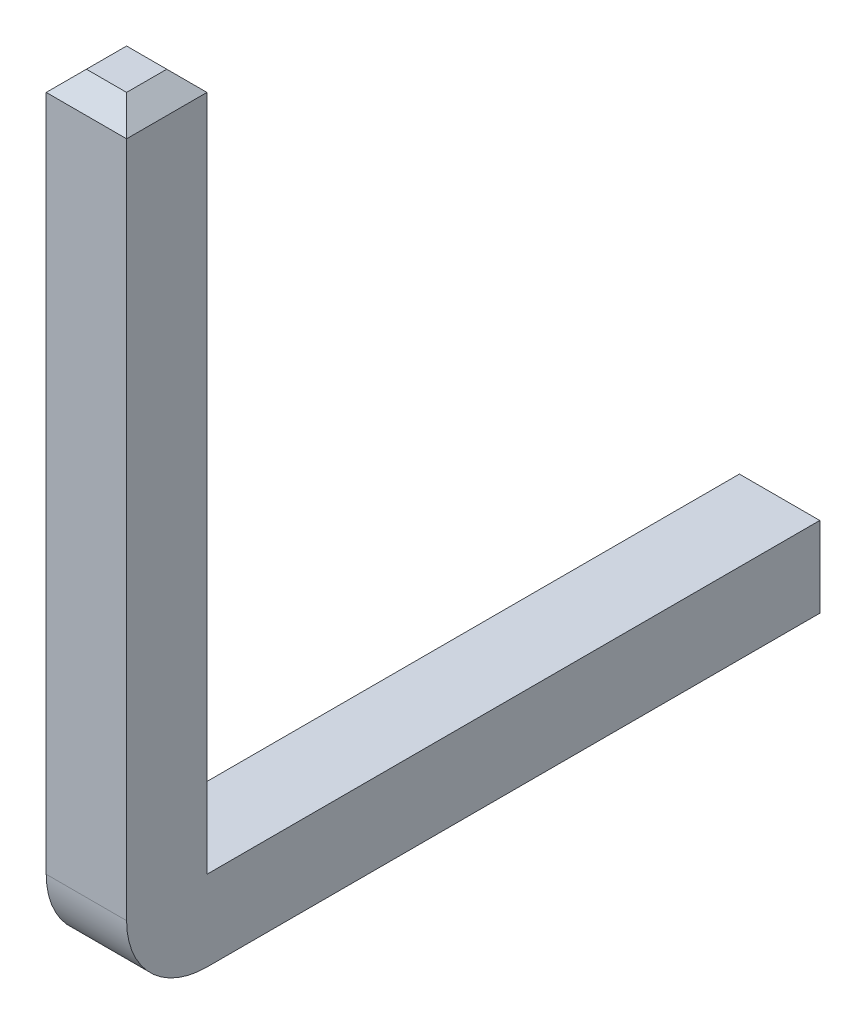
ISO-10303-21;
HEADER;
FILE_DESCRIPTION(('STEP AP214'),'2;1');
FILE_NAME('part.step','',(''),(''),'','','');
FILE_SCHEMA(('AUTOMOTIVE_DESIGN { 1 0 10303 214 1 1 1 1 }'));
ENDSEC;
DATA;
#1=APPLICATION_CONTEXT('core data for automotive mechanical design processes');
#2=APPLICATION_PROTOCOL_DEFINITION('international standard','automotive_design',2000,#1);
#3=PRODUCT_CONTEXT('',#1,'mechanical');
#4=PRODUCT('Part','Part','',(#3));
#5=PRODUCT_RELATED_PRODUCT_CATEGORY('part','',(#4));
#6=PRODUCT_DEFINITION_FORMATION('','',#4);
#7=PRODUCT_DEFINITION_CONTEXT('part definition',#1,'design');
#8=PRODUCT_DEFINITION('design','',#6,#7);
#9=PRODUCT_DEFINITION_SHAPE('','',#8);
#10=(LENGTH_UNIT() NAMED_UNIT(*) SI_UNIT(.MILLI.,.METRE.));
#11=(NAMED_UNIT(*) PLANE_ANGLE_UNIT() SI_UNIT($,.RADIAN.));
#12=(NAMED_UNIT(*) SI_UNIT($,.STERADIAN.) SOLID_ANGLE_UNIT());
#13=UNCERTAINTY_MEASURE_WITH_UNIT(LENGTH_MEASURE(1.E-05),#10,'distance_accuracy_value','');
#14=(GEOMETRIC_REPRESENTATION_CONTEXT(3) GLOBAL_UNCERTAINTY_ASSIGNED_CONTEXT((#13)) GLOBAL_UNIT_ASSIGNED_CONTEXT((#10,
#11,#12)) REPRESENTATION_CONTEXT('',''));
#15=CARTESIAN_POINT('',(0.,0.,0.));
#16=DIRECTION('',(0.,0.,1.));
#17=DIRECTION('',(1.,0.,0.));
#18=AXIS2_PLACEMENT_3D('',#15,#16,#17);
#19=CARTESIAN_POINT('',(0.3,3.67,-3.3));
#20=DIRECTION('',(0.707106781186547,0.,-0.707106781186548));
#21=DIRECTION('',(-0.707106781186548,0.,-0.707106781186547));
#22=AXIS2_PLACEMENT_3D('',#19,#20,#21);
#23=PLANE('',#22);
#24=DIRECTION('',(0.,1.,0.));
#25=VECTOR('',#24,1.);
#26=CARTESIAN_POINT('',(0.4,7.34,-3.2));
#27=LINE('',#26,#25);
#28=CARTESIAN_POINT('',(0.4,-0.4,-3.2));
#29=VERTEX_POINT('',#28);
#30=CARTESIAN_POINT('',(0.4,0.4,-3.2));
#31=VERTEX_POINT('',#30);
#32=EDGE_CURVE('E158',#29,#31,#27,.T.);
#33=ORIENTED_EDGE('',*,*,#32,.F.);
#34=DIRECTION('',(0.577350269189626,-0.577350269189625,0.577350269189627));
#35=VECTOR('',#34,1.);
#36=CARTESIAN_POINT('',(0.2,-0.2,-3.4));
#37=LINE('',#36,#35);
#38=CARTESIAN_POINT('',(0.2,-0.2,-3.4));
#39=VERTEX_POINT('',#38);
#40=EDGE_CURVE('E191',#39,#29,#37,.T.);
#41=ORIENTED_EDGE('',*,*,#40,.F.);
#42=DIRECTION('',(0.,1.,0.));
#43=VECTOR('',#42,1.);
#44=CARTESIAN_POINT('',(0.2,0.,-3.4));
#45=LINE('',#44,#43);
#46=CARTESIAN_POINT('',(0.2,0.2,-3.4));
#47=VERTEX_POINT('',#46);
#48=EDGE_CURVE('E203',#39,#47,#45,.T.);
#49=ORIENTED_EDGE('',*,*,#48,.T.);
#50=DIRECTION('',(-0.577350269189625,-0.577350269189626,-0.577350269189627));
#51=VECTOR('',#50,1.);
#52=CARTESIAN_POINT('',(0.4,0.400000000000001,-3.2));
#53=LINE('',#52,#51);
#54=EDGE_CURVE('E155',#31,#47,#53,.T.);
#55=ORIENTED_EDGE('',*,*,#54,.F.);
#56=EDGE_LOOP('',(#33,#41,#49,#55));
#57=FACE_BOUND('',#56,.T.);
#58=ADVANCED_FACE('F16',(#57),#23,.T.);
#59=CARTESIAN_POINT('',(0.3,7.24,3.1));
#60=DIRECTION('',(0.707106781186548,0.707106781186547,0.));
#61=DIRECTION('',(-0.707106781186547,0.707106781186548,0.));
#62=AXIS2_PLACEMENT_3D('',#59,#60,#61);
#63=PLANE('',#62);
#64=DIRECTION('',(0.,0.,1.));
#65=VECTOR('',#64,1.);
#66=CARTESIAN_POINT('',(0.2,7.34,3.3));
#67=LINE('',#66,#65);
#68=CARTESIAN_POINT('',(0.2,7.34,3.5));
#69=VERTEX_POINT('',#68);
#70=CARTESIAN_POINT('',(0.2,7.34,3.1));
#71=VERTEX_POINT('',#70);
#72=EDGE_CURVE('E179',#69,#71,#67,.F.);
#73=ORIENTED_EDGE('',*,*,#72,.F.);
#74=DIRECTION('',(-0.577350269189626,0.577350269189625,-0.577350269189627));
#75=VECTOR('',#74,1.);
#76=CARTESIAN_POINT('',(0.4,7.14,3.7));
#77=LINE('',#76,#75);
#78=CARTESIAN_POINT('',(0.4,7.14,3.7));
#79=VERTEX_POINT('',#78);
#80=EDGE_CURVE('E180',#79,#69,#77,.T.);
#81=ORIENTED_EDGE('',*,*,#80,.F.);
#82=DIRECTION('',(0.,0.,-1.));
#83=VECTOR('',#82,1.);
#84=CARTESIAN_POINT('',(0.4,7.14,2.9));
#85=LINE('',#84,#83);
#86=CARTESIAN_POINT('',(0.4,7.14,2.9));
#87=VERTEX_POINT('',#86);
#88=EDGE_CURVE('E144',#87,#79,#85,.F.);
#89=ORIENTED_EDGE('',*,*,#88,.F.);
#90=DIRECTION('',(0.577350269189624,-0.577350269189626,-0.577350269189627));
#91=VECTOR('',#90,1.);
#92=CARTESIAN_POINT('',(0.2,7.34,3.1));
#93=LINE('',#92,#91);
#94=EDGE_CURVE('E211',#71,#87,#93,.T.);
#95=ORIENTED_EDGE('',*,*,#94,.F.);
#96=EDGE_LOOP('',(#73,#81,#89,#95));
#97=FACE_BOUND('',#96,.T.);
#98=ADVANCED_FACE('F301',(#97),#63,.T.);
#99=CARTESIAN_POINT('',(0.,0.,-3.4));
#100=DIRECTION('',(0.,0.,1.));
#101=DIRECTION('',(1.,0.,0.));
#102=AXIS2_PLACEMENT_3D('',#99,#100,#101);
#103=PLANE('',#102);
#104=DIRECTION('',(0.,1.,0.));
#105=VECTOR('',#104,1.);
#106=CARTESIAN_POINT('',(-0.2,3.67,-3.4));
#107=LINE('',#106,#105);
#108=CARTESIAN_POINT('',(-0.2,0.2,-3.4));
#109=VERTEX_POINT('',#108);
#110=CARTESIAN_POINT('',(-0.2,-0.2,-3.4));
#111=VERTEX_POINT('',#110);
#112=EDGE_CURVE('E138',#109,#111,#107,.F.);
#113=ORIENTED_EDGE('',*,*,#112,.F.);
#114=DIRECTION('',(1.,0.,0.));
#115=VECTOR('',#114,1.);
#116=CARTESIAN_POINT('',(-0.2,0.200000000000001,-3.4));
#117=LINE('',#116,#115);
#118=EDGE_CURVE('E159',#47,#109,#117,.F.);
#119=ORIENTED_EDGE('',*,*,#118,.F.);
#120=ORIENTED_EDGE('',*,*,#48,.F.);
#121=DIRECTION('',(1.,0.,0.));
#122=VECTOR('',#121,1.);
#123=CARTESIAN_POINT('',(0.2,-0.2,-3.4));
#124=LINE('',#123,#122);
#125=EDGE_CURVE('E198',#111,#39,#124,.T.);
#126=ORIENTED_EDGE('',*,*,#125,.F.);
#127=EDGE_LOOP('',(#113,#119,#120,#126));
#128=FACE_BOUND('',#127,.T.);
#129=ADVANCED_FACE('F299',(#128),#103,.F.);
#130=CARTESIAN_POINT('',(0.2,-0.3,-3.3));
#131=DIRECTION('',(0.,-0.707106781186549,-0.707106781186546));
#132=DIRECTION('',(0.,0.707106781186546,-0.707106781186549));
#133=AXIS2_PLACEMENT_3D('',#130,#131,#132);
#134=PLANE('',#133);
#135=DIRECTION('',(1.,0.,0.));
#136=VECTOR('',#135,1.);
#137=CARTESIAN_POINT('',(0.4,-0.4,-3.2));
#138=LINE('',#137,#136);
#139=CARTESIAN_POINT('',(-0.4,-0.4,-3.2));
#140=VERTEX_POINT('',#139);
#141=EDGE_CURVE('E103',#140,#29,#138,.T.);
#142=ORIENTED_EDGE('',*,*,#141,.F.);
#143=DIRECTION('',(-0.577350269189626,-0.577350269189625,0.577350269189625));
#144=VECTOR('',#143,1.);
#145=CARTESIAN_POINT('',(-0.2,-0.2,-3.4));
#146=LINE('',#145,#144);
#147=EDGE_CURVE('E126',#111,#140,#146,.T.);
#148=ORIENTED_EDGE('',*,*,#147,.F.);
#149=ORIENTED_EDGE('',*,*,#125,.T.);
#150=ORIENTED_EDGE('',*,*,#40,.T.);
#151=EDGE_LOOP('',(#142,#148,#149,#150));
#152=FACE_BOUND('',#151,.T.);
#153=ADVANCED_FACE('F295',(#152),#134,.T.);
#154=CARTESIAN_POINT('',(0.2,7.24,3.6));
#155=DIRECTION('',(0.,0.707106781186548,0.707106781186548));
#156=DIRECTION('',(0.,-0.707106781186548,0.707106781186548));
#157=AXIS2_PLACEMENT_3D('',#154,#155,#156);
#158=PLANE('',#157);
#159=DIRECTION('',(1.,0.,0.));
#160=VECTOR('',#159,1.);
#161=CARTESIAN_POINT('',(0.,7.34,3.5));
#162=LINE('',#161,#160);
#163=CARTESIAN_POINT('',(-0.200000000000001,7.34,3.5));
#164=VERTEX_POINT('',#163);
#165=EDGE_CURVE('E176',#164,#69,#162,.T.);
#166=ORIENTED_EDGE('',*,*,#165,.F.);
#167=DIRECTION('',(0.577350269189626,0.577350269189625,-0.577350269189627));
#168=VECTOR('',#167,1.);
#169=CARTESIAN_POINT('',(-0.4,7.14,3.7));
#170=LINE('',#169,#168);
#171=CARTESIAN_POINT('',(-0.4,7.14,3.7));
#172=VERTEX_POINT('',#171);
#173=EDGE_CURVE('E173',#172,#164,#170,.T.);
#174=ORIENTED_EDGE('',*,*,#173,.F.);
#175=DIRECTION('',(1.,0.,0.));
#176=VECTOR('',#175,1.);
#177=CARTESIAN_POINT('',(0.4,7.14,3.7));
#178=LINE('',#177,#176);
#179=EDGE_CURVE('E115',#79,#172,#178,.F.);
#180=ORIENTED_EDGE('',*,*,#179,.F.);
#181=ORIENTED_EDGE('',*,*,#80,.T.);
#182=EDGE_LOOP('',(#166,#174,#180,#181));
#183=FACE_BOUND('',#182,.T.);
#184=ADVANCED_FACE('F267',(#183),#158,.T.);
#185=CARTESIAN_POINT('',(0.,7.34,3.3));
#186=DIRECTION('',(0.,1.,0.));
#187=DIRECTION('',(0.,0.,1.));
#188=AXIS2_PLACEMENT_3D('',#185,#186,#187);
#189=PLANE('',#188);
#190=ORIENTED_EDGE('',*,*,#165,.T.);
#191=ORIENTED_EDGE('',*,*,#72,.T.);
#192=DIRECTION('',(1.,0.,0.));
#193=VECTOR('',#192,1.);
#194=CARTESIAN_POINT('',(-0.2,7.34,3.1));
#195=LINE('',#194,#193);
#196=CARTESIAN_POINT('',(-0.2,7.34,3.1));
#197=VERTEX_POINT('',#196);
#198=EDGE_CURVE('E216',#197,#71,#195,.T.);
#199=ORIENTED_EDGE('',*,*,#198,.F.);
#200=DIRECTION('',(0.,0.,1.));
#201=VECTOR('',#200,1.);
#202=CARTESIAN_POINT('',(-0.200000000000001,7.34,3.5));
#203=LINE('',#202,#201);
#204=EDGE_CURVE('E169',#164,#197,#203,.F.);
#205=ORIENTED_EDGE('',*,*,#204,.F.);
#206=EDGE_LOOP('',(#190,#191,#199,#205));
#207=FACE_BOUND('',#206,.T.);
#208=ADVANCED_FACE('F334',(#207),#189,.T.);
#209=CARTESIAN_POINT('',(-0.2,7.24,3.));
#210=DIRECTION('',(0.,0.707106781186548,-0.707106781186548));
#211=DIRECTION('',(0.,0.707106781186548,0.707106781186548));
#212=AXIS2_PLACEMENT_3D('',#209,#210,#211);
#213=PLANE('',#212);
#214=DIRECTION('',(1.,0.,0.));
#215=VECTOR('',#214,1.);
#216=CARTESIAN_POINT('',(-0.4,7.14,2.9));
#217=LINE('',#216,#215);
#218=CARTESIAN_POINT('',(-0.4,7.14,2.9));
#219=VERTEX_POINT('',#218);
#220=EDGE_CURVE('E220',#219,#87,#217,.T.);
#221=ORIENTED_EDGE('',*,*,#220,.F.);
#222=DIRECTION('',(-0.577350269189625,-0.577350269189625,-0.577350269189627));
#223=VECTOR('',#222,1.);
#224=CARTESIAN_POINT('',(-0.200000000000001,7.34,3.1));
#225=LINE('',#224,#223);
#226=EDGE_CURVE('E172',#197,#219,#225,.T.);
#227=ORIENTED_EDGE('',*,*,#226,.F.);
#228=ORIENTED_EDGE('',*,*,#198,.T.);
#229=ORIENTED_EDGE('',*,*,#94,.T.);
#230=EDGE_LOOP('',(#221,#227,#228,#229));
#231=FACE_BOUND('',#230,.T.);
#232=ADVANCED_FACE('F279',(#231),#213,.T.);
#233=CARTESIAN_POINT('',(-0.2,0.300000000000001,-3.3));
#234=DIRECTION('',(0.,0.707106781186548,-0.707106781186547));
#235=DIRECTION('',(0.,0.707106781186547,0.707106781186548));
#236=AXIS2_PLACEMENT_3D('',#233,#234,#235);
#237=PLANE('',#236);
#238=DIRECTION('',(1.,0.,0.));
#239=VECTOR('',#238,1.);
#240=CARTESIAN_POINT('',(-0.4,0.4,-3.2));
#241=LINE('',#240,#239);
#242=CARTESIAN_POINT('',(-0.4,0.4,-3.2));
#243=VERTEX_POINT('',#242);
#244=EDGE_CURVE('E147',#31,#243,#241,.F.);
#245=ORIENTED_EDGE('',*,*,#244,.F.);
#246=ORIENTED_EDGE('',*,*,#54,.T.);
#247=ORIENTED_EDGE('',*,*,#118,.T.);
#248=DIRECTION('',(0.577350269189625,-0.577350269189628,-0.577350269189624));
#249=VECTOR('',#248,1.);
#250=CARTESIAN_POINT('',(-0.4,0.400000000000001,-3.2));
#251=LINE('',#250,#249);
#252=EDGE_CURVE('E141',#243,#109,#251,.T.);
#253=ORIENTED_EDGE('',*,*,#252,.F.);
#254=EDGE_LOOP('',(#245,#246,#247,#253));
#255=FACE_BOUND('',#254,.T.);
#256=ADVANCED_FACE('F287',(#255),#237,.T.);
#257=CARTESIAN_POINT('',(0.4,7.34,2.9));
#258=DIRECTION('',(1.,0.,0.));
#259=DIRECTION('',(0.,0.,-1.));
#260=AXIS2_PLACEMENT_3D('',#257,#258,#259);
#261=PLANE('',#260);
#262=CARTESIAN_POINT('',(0.4,0.4,2.9));
#263=DIRECTION('',(1.,0.,0.));
#264=DIRECTION('',(0.,0.,-1.));
#265=AXIS2_PLACEMENT_3D('',#262,#263,#264);
#266=CIRCLE('',#265,0.800000000000001);
#267=CARTESIAN_POINT('',(0.4,-0.400000000000001,2.9));
#268=VERTEX_POINT('',#267);
#269=CARTESIAN_POINT('',(0.4,0.4,3.7));
#270=VERTEX_POINT('',#269);
#271=EDGE_CURVE('E19',#268,#270,#266,.F.);
#272=ORIENTED_EDGE('',*,*,#271,.F.);
#273=DIRECTION('',(0.,0.,-1.));
#274=VECTOR('',#273,1.);
#275=CARTESIAN_POINT('',(0.4,-0.4,2.9));
#276=LINE('',#275,#274);
#277=EDGE_CURVE('E96',#29,#268,#276,.F.);
#278=ORIENTED_EDGE('',*,*,#277,.F.);
#279=ORIENTED_EDGE('',*,*,#32,.T.);
#280=DIRECTION('',(0.,0.,1.));
#281=VECTOR('',#280,1.);
#282=CARTESIAN_POINT('',(0.4,0.4,2.9));
#283=LINE('',#282,#281);
#284=CARTESIAN_POINT('',(0.4,0.4,2.9));
#285=VERTEX_POINT('',#284);
#286=EDGE_CURVE('E133',#285,#31,#283,.F.);
#287=ORIENTED_EDGE('',*,*,#286,.F.);
#288=DIRECTION('',(0.,1.,0.));
#289=VECTOR('',#288,1.);
#290=CARTESIAN_POINT('',(0.4,7.34,2.9));
#291=LINE('',#290,#289);
#292=EDGE_CURVE('E150',#87,#285,#291,.F.);
#293=ORIENTED_EDGE('',*,*,#292,.F.);
#294=ORIENTED_EDGE('',*,*,#88,.T.);
#295=DIRECTION('',(0.,-1.,0.));
#296=VECTOR('',#295,1.);
#297=CARTESIAN_POINT('',(0.4,7.34,3.7));
#298=LINE('',#297,#296);
#299=EDGE_CURVE('E112',#270,#79,#298,.F.);
#300=ORIENTED_EDGE('',*,*,#299,.F.);
#301=EDGE_LOOP('',(#272,#278,#279,#287,#293,#294,#300));
#302=FACE_BOUND('',#301,.T.);
#303=ADVANCED_FACE('F109',(#302),#261,.T.);
#304=CARTESIAN_POINT('',(-0.3,3.67,-3.3));
#305=DIRECTION('',(-0.707106781186547,0.,-0.707106781186548));
#306=DIRECTION('',(-0.707106781186548,0.,0.707106781186547));
#307=AXIS2_PLACEMENT_3D('',#304,#305,#306);
#308=PLANE('',#307);
#309=ORIENTED_EDGE('',*,*,#112,.T.);
#310=ORIENTED_EDGE('',*,*,#147,.T.);
#311=DIRECTION('',(0.,1.,0.));
#312=VECTOR('',#311,1.);
#313=CARTESIAN_POINT('',(-0.4,7.34,-3.2));
#314=LINE('',#313,#312);
#315=EDGE_CURVE('E129',#243,#140,#314,.F.);
#316=ORIENTED_EDGE('',*,*,#315,.F.);
#317=ORIENTED_EDGE('',*,*,#252,.T.);
#318=EDGE_LOOP('',(#309,#310,#316,#317));
#319=FACE_BOUND('',#318,.T.);
#320=ADVANCED_FACE('F292',(#319),#308,.T.);
#321=CARTESIAN_POINT('',(0.4,-0.4,2.9));
#322=DIRECTION('',(0.,-1.,0.));
#323=DIRECTION('',(0.,0.,-1.));
#324=AXIS2_PLACEMENT_3D('',#321,#322,#323);
#325=PLANE('',#324);
#326=DIRECTION('',(1.,0.,0.));
#327=VECTOR('',#326,1.);
#328=CARTESIAN_POINT('',(0.,-0.400000000000001,2.9));
#329=LINE('',#328,#327);
#330=CARTESIAN_POINT('',(-0.4,-0.400000000000001,2.9));
#331=VERTEX_POINT('',#330);
#332=EDGE_CURVE('E101',#331,#268,#329,.T.);
#333=ORIENTED_EDGE('',*,*,#332,.F.);
#334=DIRECTION('',(0.,0.,1.));
#335=VECTOR('',#334,1.);
#336=CARTESIAN_POINT('',(-0.4,-0.4,3.7));
#337=LINE('',#336,#335);
#338=EDGE_CURVE('E132',#140,#331,#337,.T.);
#339=ORIENTED_EDGE('',*,*,#338,.F.);
#340=ORIENTED_EDGE('',*,*,#141,.T.);
#341=ORIENTED_EDGE('',*,*,#277,.T.);
#342=EDGE_LOOP('',(#333,#339,#340,#341));
#343=FACE_BOUND('',#342,.T.);
#344=ADVANCED_FACE('F98',(#343),#325,.T.);
#345=CARTESIAN_POINT('',(0.,0.4,2.9));
#346=DIRECTION('',(1.,0.,0.));
#347=DIRECTION('',(0.,0.,-1.));
#348=AXIS2_PLACEMENT_3D('',#345,#346,#347);
#349=CYLINDRICAL_SURFACE('',#348,0.800000000000001);
#350=ORIENTED_EDGE('',*,*,#332,.T.);
#351=ORIENTED_EDGE('',*,*,#271,.T.);
#352=DIRECTION('',(1.,0.,0.));
#353=VECTOR('',#352,1.);
#354=CARTESIAN_POINT('',(0.4,0.4,3.7));
#355=LINE('',#354,#353);
#356=CARTESIAN_POINT('',(-0.4,0.4,3.7));
#357=VERTEX_POINT('',#356);
#358=EDGE_CURVE('E184',#357,#270,#355,.T.);
#359=ORIENTED_EDGE('',*,*,#358,.F.);
#360=CARTESIAN_POINT('',(-0.4,0.4,2.9));
#361=DIRECTION('',(1.,0.,0.));
#362=DIRECTION('',(0.,0.,-1.));
#363=AXIS2_PLACEMENT_3D('',#360,#361,#362);
#364=CIRCLE('',#363,0.800000000000001);
#365=EDGE_CURVE('E118',#331,#357,#364,.F.);
#366=ORIENTED_EDGE('',*,*,#365,.F.);
#367=EDGE_LOOP('',(#350,#351,#359,#366));
#368=FACE_BOUND('',#367,.T.);
#369=ADVANCED_FACE('F116',(#368),#349,.T.);
#370=CARTESIAN_POINT('',(0.4,7.34,3.7));
#371=DIRECTION('',(0.,0.,1.));
#372=DIRECTION('',(0.,-1.,0.));
#373=AXIS2_PLACEMENT_3D('',#370,#371,#372);
#374=PLANE('',#373);
#375=ORIENTED_EDGE('',*,*,#358,.T.);
#376=ORIENTED_EDGE('',*,*,#299,.T.);
#377=ORIENTED_EDGE('',*,*,#179,.T.);
#378=DIRECTION('',(0.,1.,0.));
#379=VECTOR('',#378,1.);
#380=CARTESIAN_POINT('',(-0.4,7.34,3.7));
#381=LINE('',#380,#379);
#382=EDGE_CURVE('E240',#357,#172,#381,.T.);
#383=ORIENTED_EDGE('',*,*,#382,.F.);
#384=EDGE_LOOP('',(#375,#376,#377,#383));
#385=FACE_BOUND('',#384,.T.);
#386=ADVANCED_FACE('F270',(#385),#374,.T.);
#387=CARTESIAN_POINT('',(-0.3,7.24,3.5));
#388=DIRECTION('',(-0.707106781186548,0.707106781186547,0.));
#389=DIRECTION('',(-0.707106781186547,-0.707106781186548,0.));
#390=AXIS2_PLACEMENT_3D('',#387,#388,#389);
#391=PLANE('',#390);
#392=ORIENTED_EDGE('',*,*,#204,.T.);
#393=ORIENTED_EDGE('',*,*,#226,.T.);
#394=DIRECTION('',(0.,0.,1.));
#395=VECTOR('',#394,1.);
#396=CARTESIAN_POINT('',(-0.4,7.14,3.7));
#397=LINE('',#396,#395);
#398=EDGE_CURVE('E243',#172,#219,#397,.F.);
#399=ORIENTED_EDGE('',*,*,#398,.F.);
#400=ORIENTED_EDGE('',*,*,#173,.T.);
#401=EDGE_LOOP('',(#392,#393,#399,#400));
#402=FACE_BOUND('',#401,.T.);
#403=ADVANCED_FACE('F263',(#402),#391,.T.);
#404=CARTESIAN_POINT('',(-0.4,7.34,2.9));
#405=DIRECTION('',(0.,0.,-1.));
#406=DIRECTION('',(0.,1.,0.));
#407=AXIS2_PLACEMENT_3D('',#404,#405,#406);
#408=PLANE('',#407);
#409=DIRECTION('',(1.,0.,0.));
#410=VECTOR('',#409,1.);
#411=CARTESIAN_POINT('',(-0.4,0.4,2.9));
#412=LINE('',#411,#410);
#413=CARTESIAN_POINT('',(-0.4,0.4,2.9));
#414=VERTEX_POINT('',#413);
#415=EDGE_CURVE('E34',#414,#285,#412,.T.);
#416=ORIENTED_EDGE('',*,*,#415,.F.);
#417=DIRECTION('',(0.,1.,0.));
#418=VECTOR('',#417,1.);
#419=CARTESIAN_POINT('',(-0.4,7.34,2.9));
#420=LINE('',#419,#418);
#421=EDGE_CURVE('E25',#219,#414,#420,.F.);
#422=ORIENTED_EDGE('',*,*,#421,.F.);
#423=ORIENTED_EDGE('',*,*,#220,.T.);
#424=ORIENTED_EDGE('',*,*,#292,.T.);
#425=EDGE_LOOP('',(#416,#422,#423,#424));
#426=FACE_BOUND('',#425,.T.);
#427=ADVANCED_FACE('F274',(#426),#408,.T.);
#428=CARTESIAN_POINT('',(-0.4,0.4,2.9));
#429=DIRECTION('',(0.,1.,0.));
#430=DIRECTION('',(0.,0.,1.));
#431=AXIS2_PLACEMENT_3D('',#428,#429,#430);
#432=PLANE('',#431);
#433=ORIENTED_EDGE('',*,*,#415,.T.);
#434=ORIENTED_EDGE('',*,*,#286,.T.);
#435=ORIENTED_EDGE('',*,*,#244,.T.);
#436=DIRECTION('',(0.,0.,1.));
#437=VECTOR('',#436,1.);
#438=CARTESIAN_POINT('',(-0.4,0.4,3.7));
#439=LINE('',#438,#437);
#440=EDGE_CURVE('E10',#414,#243,#439,.F.);
#441=ORIENTED_EDGE('',*,*,#440,.F.);
#442=EDGE_LOOP('',(#433,#434,#435,#441));
#443=FACE_BOUND('',#442,.T.);
#444=ADVANCED_FACE('F284',(#443),#432,.T.);
#445=CARTESIAN_POINT('',(-0.4,7.34,3.7));
#446=DIRECTION('',(-1.,0.,0.));
#447=DIRECTION('',(0.,0.,1.));
#448=AXIS2_PLACEMENT_3D('',#445,#446,#447);
#449=PLANE('',#448);
#450=ORIENTED_EDGE('',*,*,#421,.T.);
#451=ORIENTED_EDGE('',*,*,#440,.T.);
#452=ORIENTED_EDGE('',*,*,#315,.T.);
#453=ORIENTED_EDGE('',*,*,#338,.T.);
#454=ORIENTED_EDGE('',*,*,#365,.T.);
#455=ORIENTED_EDGE('',*,*,#382,.T.);
#456=ORIENTED_EDGE('',*,*,#398,.T.);
#457=EDGE_LOOP('',(#450,#451,#452,#453,#454,#455,#456));
#458=FACE_BOUND('',#457,.T.);
#459=ADVANCED_FACE('F272',(#458),#449,.T.);
#460=CLOSED_SHELL('',(#58,#98,#129,#153,#184,#208,#232,#256,#303,#320,#344,#369,#386,#403,#427,
#444,#459));
#461=MANIFOLD_SOLID_BREP('B1',#460);
#462=ADVANCED_BREP_SHAPE_REPRESENTATION('',(#18,#461),#14);
#463=SHAPE_DEFINITION_REPRESENTATION(#9,#462);
ENDSEC;
END-ISO-10303-21;
